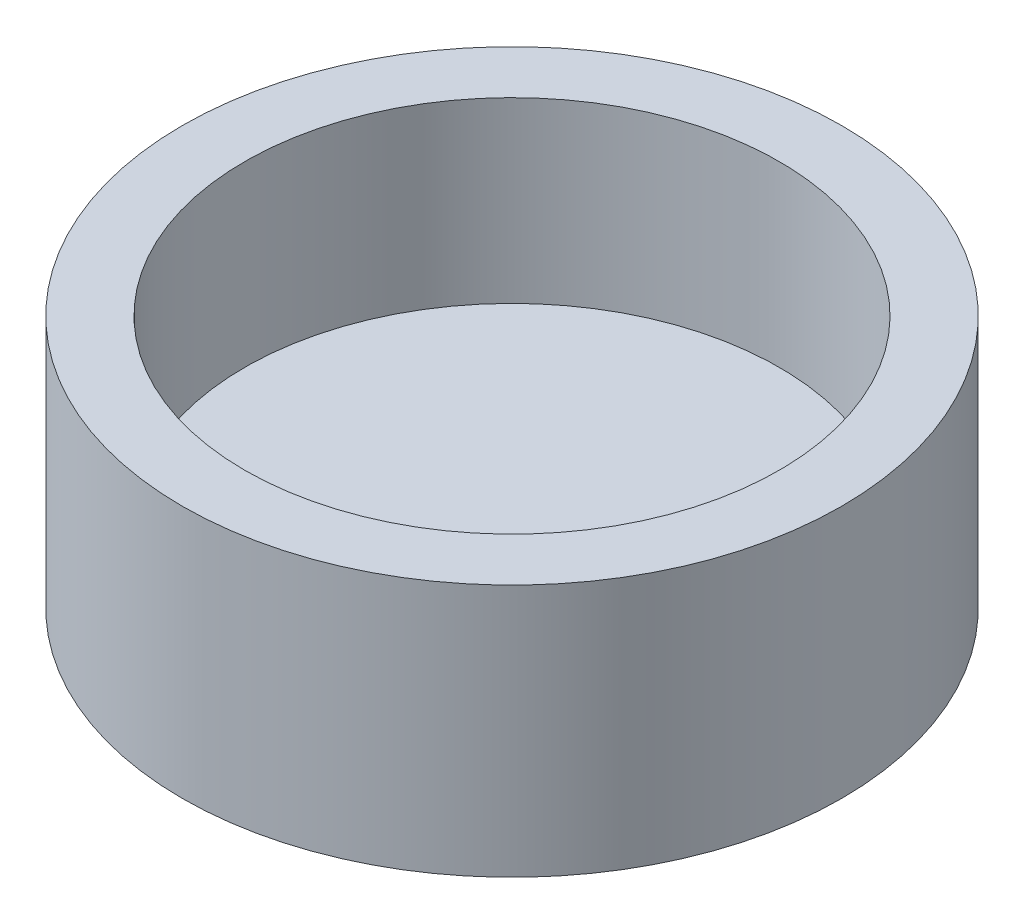
ISO-10303-21;
HEADER;
FILE_DESCRIPTION(('STEP AP214'),'2;1');
FILE_NAME('part.step','',(''),(''),'','','');
FILE_SCHEMA(('AUTOMOTIVE_DESIGN { 1 0 10303 214 1 1 1 1 }'));
ENDSEC;
DATA;
#1=APPLICATION_CONTEXT('core data for automotive mechanical design processes');
#2=APPLICATION_PROTOCOL_DEFINITION('international standard','automotive_design',2000,#1);
#3=PRODUCT_CONTEXT('',#1,'mechanical');
#4=PRODUCT('Part','Part','',(#3));
#5=PRODUCT_RELATED_PRODUCT_CATEGORY('part','',(#4));
#6=PRODUCT_DEFINITION_FORMATION('','',#4);
#7=PRODUCT_DEFINITION_CONTEXT('part definition',#1,'design');
#8=PRODUCT_DEFINITION('design','',#6,#7);
#9=PRODUCT_DEFINITION_SHAPE('','',#8);
#10=(LENGTH_UNIT() NAMED_UNIT(*) SI_UNIT(.MILLI.,.METRE.));
#11=(NAMED_UNIT(*) PLANE_ANGLE_UNIT() SI_UNIT($,.RADIAN.));
#12=(NAMED_UNIT(*) SI_UNIT($,.STERADIAN.) SOLID_ANGLE_UNIT());
#13=UNCERTAINTY_MEASURE_WITH_UNIT(LENGTH_MEASURE(1.E-05),#10,'distance_accuracy_value','');
#14=(GEOMETRIC_REPRESENTATION_CONTEXT(3) GLOBAL_UNCERTAINTY_ASSIGNED_CONTEXT((#13)) GLOBAL_UNIT_ASSIGNED_CONTEXT((#10,
#11,#12)) REPRESENTATION_CONTEXT('',''));
#15=CARTESIAN_POINT('',(0.,0.,0.));
#16=DIRECTION('',(0.,0.,1.));
#17=DIRECTION('',(1.,0.,0.));
#18=AXIS2_PLACEMENT_3D('',#15,#16,#17);
#19=CARTESIAN_POINT('',(0.,7.1,0.));
#20=DIRECTION('',(0.,-1.,0.));
#21=DIRECTION('',(0.,0.,-1.));
#22=AXIS2_PLACEMENT_3D('',#19,#20,#21);
#23=CYLINDRICAL_SURFACE('',#22,9.25);
#24=CARTESIAN_POINT('',(0.,7.1,0.));
#25=DIRECTION('',(0.,1.,0.));
#26=DIRECTION('',(0.,0.,1.));
#27=AXIS2_PLACEMENT_3D('',#24,#25,#26);
#28=CIRCLE('',#27,9.25);
#29=CARTESIAN_POINT('',(0.,7.1,9.25));
#30=VERTEX_POINT('',#29);
#31=EDGE_CURVE('E10',#30,#30,#28,.T.);
#32=ORIENTED_EDGE('',*,*,#31,.F.);
#33=EDGE_LOOP('',(#32));
#34=FACE_BOUND('',#33,.T.);
#35=CARTESIAN_POINT('',(0.,0.,0.));
#36=DIRECTION('',(0.,1.,0.));
#37=DIRECTION('',(0.,0.,1.));
#38=AXIS2_PLACEMENT_3D('',#35,#36,#37);
#39=CIRCLE('',#38,9.25);
#40=CARTESIAN_POINT('',(0.,0.,9.25));
#41=VERTEX_POINT('',#40);
#42=EDGE_CURVE('E36',#41,#41,#39,.T.);
#43=ORIENTED_EDGE('',*,*,#42,.T.);
#44=EDGE_LOOP('',(#43));
#45=FACE_BOUND('',#44,.T.);
#46=ADVANCED_FACE('F33',(#34,#45),#23,.T.);
#47=CARTESIAN_POINT('',(0.,7.1,0.));
#48=DIRECTION('',(0.,1.,0.));
#49=DIRECTION('',(0.,0.,1.));
#50=AXIS2_PLACEMENT_3D('',#47,#48,#49);
#51=PLANE('',#50);
#52=CARTESIAN_POINT('',(0.,7.1,0.));
#53=DIRECTION('',(0.,1.,0.));
#54=DIRECTION('',(0.,0.,1.));
#55=AXIS2_PLACEMENT_3D('',#52,#53,#54);
#56=CIRCLE('',#55,7.5);
#57=CARTESIAN_POINT('',(0.,7.1,7.5));
#58=VERTEX_POINT('',#57);
#59=EDGE_CURVE('E45',#58,#58,#56,.T.);
#60=ORIENTED_EDGE('',*,*,#59,.F.);
#61=EDGE_LOOP('',(#60));
#62=FACE_BOUND('',#61,.T.);
#63=ORIENTED_EDGE('',*,*,#31,.T.);
#64=EDGE_LOOP('',(#63));
#65=FACE_BOUND('',#64,.T.);
#66=ADVANCED_FACE('F60',(#62,#65),#51,.T.);
#67=CARTESIAN_POINT('',(0.,0.,0.));
#68=DIRECTION('',(0.,1.,0.));
#69=DIRECTION('',(0.,0.,1.));
#70=AXIS2_PLACEMENT_3D('',#67,#68,#69);
#71=PLANE('',#70);
#72=ORIENTED_EDGE('',*,*,#42,.F.);
#73=EDGE_LOOP('',(#72));
#74=FACE_BOUND('',#73,.T.);
#75=ADVANCED_FACE('F56',(#74),#71,.F.);
#76=CARTESIAN_POINT('',(0.,2.1,0.));
#77=DIRECTION('',(0.,1.,0.));
#78=DIRECTION('',(0.,0.,1.));
#79=AXIS2_PLACEMENT_3D('',#76,#77,#78);
#80=CYLINDRICAL_SURFACE('',#79,7.5);
#81=CARTESIAN_POINT('',(0.,2.1,0.));
#82=DIRECTION('',(0.,1.,0.));
#83=DIRECTION('',(0.,0.,1.));
#84=AXIS2_PLACEMENT_3D('',#81,#82,#83);
#85=CIRCLE('',#84,7.5);
#86=CARTESIAN_POINT('',(0.,2.1,7.5));
#87=VERTEX_POINT('',#86);
#88=EDGE_CURVE('E43',#87,#87,#85,.T.);
#89=ORIENTED_EDGE('',*,*,#88,.F.);
#90=EDGE_LOOP('',(#89));
#91=FACE_BOUND('',#90,.T.);
#92=ORIENTED_EDGE('',*,*,#59,.T.);
#93=EDGE_LOOP('',(#92));
#94=FACE_BOUND('',#93,.T.);
#95=ADVANCED_FACE('F53',(#91,#94),#80,.F.);
#96=CARTESIAN_POINT('',(0.,2.1,0.));
#97=DIRECTION('',(0.,1.,0.));
#98=DIRECTION('',(0.,0.,1.));
#99=AXIS2_PLACEMENT_3D('',#96,#97,#98);
#100=PLANE('',#99);
#101=ORIENTED_EDGE('',*,*,#88,.T.);
#102=EDGE_LOOP('',(#101));
#103=FACE_BOUND('',#102,.T.);
#104=ADVANCED_FACE('F51',(#103),#100,.T.);
#105=CLOSED_SHELL('',(#46,#66,#75,#95,#104));
#106=MANIFOLD_SOLID_BREP('B2',#105);
#107=ADVANCED_BREP_SHAPE_REPRESENTATION('',(#18,#106),#14);
#108=SHAPE_DEFINITION_REPRESENTATION(#9,#107);
ENDSEC;
END-ISO-10303-21;
